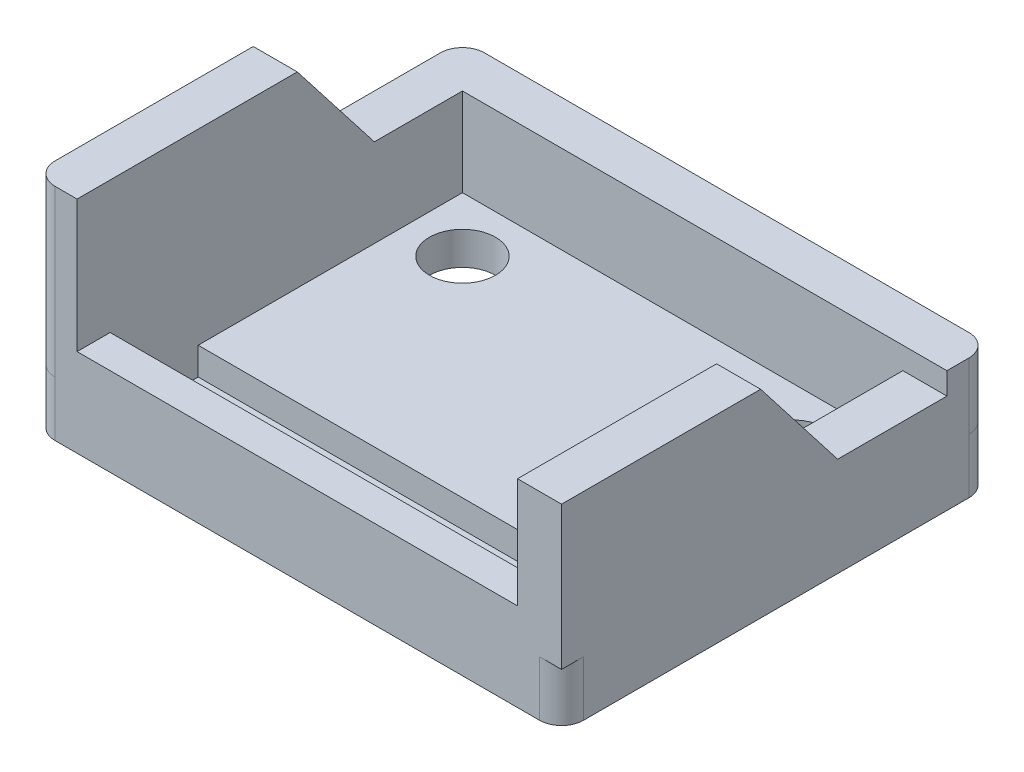
ISO-10303-21;
HEADER;
FILE_DESCRIPTION(('STEP AP214'),'2;1');
FILE_NAME('part.step','',(''),(''),'','','');
FILE_SCHEMA(('AUTOMOTIVE_DESIGN { 1 0 10303 214 1 1 1 1 }'));
ENDSEC;
DATA;
#1=APPLICATION_CONTEXT('core data for automotive mechanical design processes');
#2=APPLICATION_PROTOCOL_DEFINITION('international standard','automotive_design',2000,#1);
#3=PRODUCT_CONTEXT('',#1,'mechanical');
#4=PRODUCT('Part','Part','',(#3));
#5=PRODUCT_RELATED_PRODUCT_CATEGORY('part','',(#4));
#6=PRODUCT_DEFINITION_FORMATION('','',#4);
#7=PRODUCT_DEFINITION_CONTEXT('part definition',#1,'design');
#8=PRODUCT_DEFINITION('design','',#6,#7);
#9=PRODUCT_DEFINITION_SHAPE('','',#8);
#10=(LENGTH_UNIT() NAMED_UNIT(*) SI_UNIT(.MILLI.,.METRE.));
#11=(NAMED_UNIT(*) PLANE_ANGLE_UNIT() SI_UNIT($,.RADIAN.));
#12=(NAMED_UNIT(*) SI_UNIT($,.STERADIAN.) SOLID_ANGLE_UNIT());
#13=UNCERTAINTY_MEASURE_WITH_UNIT(LENGTH_MEASURE(1.E-05),#10,'distance_accuracy_value','');
#14=(GEOMETRIC_REPRESENTATION_CONTEXT(3) GLOBAL_UNCERTAINTY_ASSIGNED_CONTEXT((#13)) GLOBAL_UNIT_ASSIGNED_CONTEXT((#10,
#11,#12)) REPRESENTATION_CONTEXT('',''));
#15=CARTESIAN_POINT('',(0.,0.,0.));
#16=DIRECTION('',(0.,0.,1.));
#17=DIRECTION('',(1.,0.,0.));
#18=AXIS2_PLACEMENT_3D('',#15,#16,#17);
#19=CARTESIAN_POINT('',(0.,2.5,-17.5));
#20=DIRECTION('',(0.,0.,-1.));
#21=DIRECTION('',(-1.,0.,0.));
#22=AXIS2_PLACEMENT_3D('',#19,#20,#21);
#23=PLANE('',#22);
#24=DIRECTION('',(1.,0.,0.));
#25=VECTOR('',#24,1.);
#26=CARTESIAN_POINT('',(3.33184529740553,4.5,-17.5));
#27=LINE('',#26,#25);
#28=CARTESIAN_POINT('',(22.,4.5,-17.5));
#29=VERTEX_POINT('',#28);
#30=CARTESIAN_POINT('',(24.,4.5,-17.5));
#31=VERTEX_POINT('',#30);
#32=EDGE_CURVE('E242',#29,#31,#27,.T.);
#33=ORIENTED_EDGE('',*,*,#32,.T.);
#34=DIRECTION('',(0.,-1.,0.));
#35=VECTOR('',#34,1.);
#36=CARTESIAN_POINT('',(24.,0.,-17.5));
#37=LINE('',#36,#35);
#38=CARTESIAN_POINT('',(24.,5.5,-17.5));
#39=VERTEX_POINT('',#38);
#40=EDGE_CURVE('E231',#39,#31,#37,.T.);
#41=ORIENTED_EDGE('',*,*,#40,.F.);
#42=DIRECTION('',(1.,0.,0.));
#43=VECTOR('',#42,1.);
#44=CARTESIAN_POINT('',(0.,5.5,-17.5));
#45=LINE('',#44,#43);
#46=CARTESIAN_POINT('',(2.,5.5,-17.5));
#47=VERTEX_POINT('',#46);
#48=EDGE_CURVE('E255',#47,#39,#45,.T.);
#49=ORIENTED_EDGE('',*,*,#48,.F.);
#50=DIRECTION('',(0.,-1.,0.));
#51=VECTOR('',#50,1.);
#52=CARTESIAN_POINT('',(2.,2.5,-17.5));
#53=LINE('',#52,#51);
#54=CARTESIAN_POINT('',(2.,1.5,-17.5));
#55=VERTEX_POINT('',#54);
#56=EDGE_CURVE('E370',#47,#55,#53,.T.);
#57=ORIENTED_EDGE('',*,*,#56,.T.);
#58=DIRECTION('',(1.,0.,0.));
#59=VECTOR('',#58,1.);
#60=CARTESIAN_POINT('',(0.,1.5,-17.5));
#61=LINE('',#60,#59);
#62=CARTESIAN_POINT('',(22.,1.5,-17.5));
#63=VERTEX_POINT('',#62);
#64=EDGE_CURVE('E305',#55,#63,#61,.T.);
#65=ORIENTED_EDGE('',*,*,#64,.T.);
#66=DIRECTION('',(0.,-1.,0.));
#67=VECTOR('',#66,1.);
#68=CARTESIAN_POINT('',(22.,2.5,-17.5));
#69=LINE('',#68,#67);
#70=EDGE_CURVE('E367',#29,#63,#69,.T.);
#71=ORIENTED_EDGE('',*,*,#70,.F.);
#72=EDGE_LOOP('',(#33,#41,#49,#57,#65,#71));
#73=FACE_BOUND('',#72,.T.);
#74=ADVANCED_FACE('F39',(#73),#23,.F.);
#75=CARTESIAN_POINT('',(0.,4.,-1.5));
#76=DIRECTION('',(0.,0.,-1.));
#77=DIRECTION('',(-1.,0.,0.));
#78=AXIS2_PLACEMENT_3D('',#75,#76,#77);
#79=PLANE('',#78);
#80=DIRECTION('',(1.,0.,0.));
#81=VECTOR('',#80,1.);
#82=CARTESIAN_POINT('',(0.,0.25,-1.5));
#83=LINE('',#82,#81);
#84=CARTESIAN_POINT('',(2.,0.25,-1.5));
#85=VERTEX_POINT('',#84);
#86=CARTESIAN_POINT('',(22.,0.25,-1.5));
#87=VERTEX_POINT('',#86);
#88=EDGE_CURVE('E291',#85,#87,#83,.T.);
#89=ORIENTED_EDGE('',*,*,#88,.F.);
#90=DIRECTION('',(0.,-1.,0.));
#91=VECTOR('',#90,1.);
#92=CARTESIAN_POINT('',(2.,4.,-1.5));
#93=LINE('',#92,#91);
#94=CARTESIAN_POINT('',(2.,4.,-1.5));
#95=VERTEX_POINT('',#94);
#96=EDGE_CURVE('E392',#95,#85,#93,.T.);
#97=ORIENTED_EDGE('',*,*,#96,.F.);
#98=DIRECTION('',(1.,0.,0.));
#99=VECTOR('',#98,1.);
#100=CARTESIAN_POINT('',(0.,4.,-1.5));
#101=LINE('',#100,#99);
#102=CARTESIAN_POINT('',(22.,4.,-1.5));
#103=VERTEX_POINT('',#102);
#104=EDGE_CURVE('E383',#95,#103,#101,.T.);
#105=ORIENTED_EDGE('',*,*,#104,.T.);
#106=DIRECTION('',(0.,-1.,0.));
#107=VECTOR('',#106,1.);
#108=CARTESIAN_POINT('',(22.,4.,-1.5));
#109=LINE('',#108,#107);
#110=EDGE_CURVE('E395',#103,#87,#109,.T.);
#111=ORIENTED_EDGE('',*,*,#110,.T.);
#112=EDGE_LOOP('',(#89,#97,#105,#111));
#113=FACE_BOUND('',#112,.T.);
#114=ADVANCED_FACE('F454',(#113),#79,.T.);
#115=CARTESIAN_POINT('',(0.,4.,0.));
#116=DIRECTION('',(0.,0.,-1.));
#117=DIRECTION('',(-1.,0.,0.));
#118=AXIS2_PLACEMENT_3D('',#115,#116,#117);
#119=PLANE('',#118);
#120=DIRECTION('',(-1.,0.,0.));
#121=VECTOR('',#120,1.);
#122=CARTESIAN_POINT('',(21.0394327646598,10.,0.));
#123=LINE('',#122,#121);
#124=CARTESIAN_POINT('',(2.,10.,0.));
#125=VERTEX_POINT('',#124);
#126=CARTESIAN_POINT('',(1.,10.,0.));
#127=VERTEX_POINT('',#126);
#128=EDGE_CURVE('E264',#125,#127,#123,.T.);
#129=ORIENTED_EDGE('',*,*,#128,.T.);
#130=DIRECTION('',(0.,-1.,0.));
#131=VECTOR('',#130,1.);
#132=CARTESIAN_POINT('',(1.,2.5,0.));
#133=LINE('',#132,#131);
#134=CARTESIAN_POINT('',(1.,2.5,0.));
#135=VERTEX_POINT('',#134);
#136=EDGE_CURVE('E411',#127,#135,#133,.T.);
#137=ORIENTED_EDGE('',*,*,#136,.T.);
#138=DIRECTION('',(0.,-1.,0.));
#139=VECTOR('',#138,1.);
#140=CARTESIAN_POINT('',(1.00000000000001,2.5,0.));
#141=LINE('',#140,#139);
#142=CARTESIAN_POINT('',(1.00000000000001,0.,0.));
#143=VERTEX_POINT('',#142);
#144=EDGE_CURVE('E373',#135,#143,#141,.T.);
#145=ORIENTED_EDGE('',*,*,#144,.T.);
#146=DIRECTION('',(1.,0.,0.));
#147=VECTOR('',#146,1.);
#148=CARTESIAN_POINT('',(0.,0.,0.));
#149=LINE('',#148,#147);
#150=CARTESIAN_POINT('',(23.,0.,0.));
#151=VERTEX_POINT('',#150);
#152=EDGE_CURVE('E380',#143,#151,#149,.T.);
#153=ORIENTED_EDGE('',*,*,#152,.T.);
#154=DIRECTION('',(0.,-1.,0.));
#155=VECTOR('',#154,1.);
#156=CARTESIAN_POINT('',(23.,2.5,0.));
#157=LINE('',#156,#155);
#158=CARTESIAN_POINT('',(23.,2.5,0.));
#159=VERTEX_POINT('',#158);
#160=EDGE_CURVE('E364',#159,#151,#157,.T.);
#161=ORIENTED_EDGE('',*,*,#160,.F.);
#162=DIRECTION('',(1.,0.,0.));
#163=VECTOR('',#162,1.);
#164=CARTESIAN_POINT('',(3.33184529740553,2.5,0.));
#165=LINE('',#164,#163);
#166=CARTESIAN_POINT('',(24.,2.5,0.));
#167=VERTEX_POINT('',#166);
#168=EDGE_CURVE('E245',#159,#167,#165,.T.);
#169=ORIENTED_EDGE('',*,*,#168,.T.);
#170=DIRECTION('',(0.,-1.,0.));
#171=VECTOR('',#170,1.);
#172=CARTESIAN_POINT('',(24.,0.,0.));
#173=LINE('',#172,#171);
#174=CARTESIAN_POINT('',(24.,9.,0.));
#175=VERTEX_POINT('',#174);
#176=EDGE_CURVE('E237',#175,#167,#173,.T.);
#177=ORIENTED_EDGE('',*,*,#176,.F.);
#178=DIRECTION('',(1.,0.,0.));
#179=VECTOR('',#178,1.);
#180=CARTESIAN_POINT('',(3.33184529740553,9.,0.));
#181=LINE('',#180,#179);
#182=CARTESIAN_POINT('',(22.,9.,0.));
#183=VERTEX_POINT('',#182);
#184=EDGE_CURVE('E247',#183,#175,#181,.T.);
#185=ORIENTED_EDGE('',*,*,#184,.F.);
#186=DIRECTION('',(0.,1.,0.));
#187=VECTOR('',#186,1.);
#188=CARTESIAN_POINT('',(22.,0.,0.));
#189=LINE('',#188,#187);
#190=CARTESIAN_POINT('',(22.,4.,0.));
#191=VERTEX_POINT('',#190);
#192=EDGE_CURVE('E440',#191,#183,#189,.T.);
#193=ORIENTED_EDGE('',*,*,#192,.F.);
#194=DIRECTION('',(1.,0.,0.));
#195=VECTOR('',#194,1.);
#196=CARTESIAN_POINT('',(0.,4.,0.));
#197=LINE('',#196,#195);
#198=CARTESIAN_POINT('',(2.,4.,0.));
#199=VERTEX_POINT('',#198);
#200=EDGE_CURVE('E389',#199,#191,#197,.T.);
#201=ORIENTED_EDGE('',*,*,#200,.F.);
#202=DIRECTION('',(0.,-1.,0.));
#203=VECTOR('',#202,1.);
#204=CARTESIAN_POINT('',(2.,0.,0.));
#205=LINE('',#204,#203);
#206=EDGE_CURVE('E271',#125,#199,#205,.T.);
#207=ORIENTED_EDGE('',*,*,#206,.F.);
#208=EDGE_LOOP('',(#129,#137,#145,#153,#161,#169,#177,#185,#193,#201,#207));
#209=FACE_BOUND('',#208,.T.);
#210=ADVANCED_FACE('F416',(#209),#119,.F.);
#211=CARTESIAN_POINT('',(0.,4.,0.));
#212=DIRECTION('',(0.,1.,0.));
#213=DIRECTION('',(0.,0.,1.));
#214=AXIS2_PLACEMENT_3D('',#211,#212,#213);
#215=PLANE('',#214);
#216=DIRECTION('',(0.,0.,1.));
#217=VECTOR('',#216,1.);
#218=CARTESIAN_POINT('',(22.,4.,0.));
#219=LINE('',#218,#217);
#220=EDGE_CURVE('E381',#103,#191,#219,.T.);
#221=ORIENTED_EDGE('',*,*,#220,.F.);
#222=ORIENTED_EDGE('',*,*,#104,.F.);
#223=DIRECTION('',(0.,0.,1.));
#224=VECTOR('',#223,1.);
#225=CARTESIAN_POINT('',(2.,4.,0.));
#226=LINE('',#225,#224);
#227=EDGE_CURVE('E386',#95,#199,#226,.T.);
#228=ORIENTED_EDGE('',*,*,#227,.T.);
#229=ORIENTED_EDGE('',*,*,#200,.T.);
#230=EDGE_LOOP('',(#221,#222,#228,#229));
#231=FACE_BOUND('',#230,.T.);
#232=ADVANCED_FACE('F450',(#231),#215,.T.);
#233=CARTESIAN_POINT('',(0.,0.,0.));
#234=DIRECTION('',(0.,1.,0.));
#235=DIRECTION('',(0.,0.,1.));
#236=AXIS2_PLACEMENT_3D('',#233,#234,#235);
#237=PLANE('',#236);
#238=ORIENTED_EDGE('',*,*,#152,.F.);
#239=CARTESIAN_POINT('',(1.,0.,-1.));
#240=DIRECTION('',(0.,1.,0.));
#241=DIRECTION('',(0.,0.,1.));
#242=AXIS2_PLACEMENT_3D('',#239,#240,#241);
#243=CIRCLE('',#242,1.);
#244=CARTESIAN_POINT('',(0.,0.,-1.00000000000001));
#245=VERTEX_POINT('',#244);
#246=EDGE_CURVE('E343',#143,#245,#243,.F.);
#247=ORIENTED_EDGE('',*,*,#246,.T.);
#248=DIRECTION('',(0.,0.,-1.));
#249=VECTOR('',#248,1.);
#250=CARTESIAN_POINT('',(0.,0.,0.));
#251=LINE('',#250,#249);
#252=CARTESIAN_POINT('',(0.,0.,-18.5));
#253=VERTEX_POINT('',#252);
#254=EDGE_CURVE('E340',#245,#253,#251,.T.);
#255=ORIENTED_EDGE('',*,*,#254,.T.);
#256=CARTESIAN_POINT('',(1.,0.,-18.5));
#257=DIRECTION('',(0.,1.,0.));
#258=DIRECTION('',(0.,0.,1.));
#259=AXIS2_PLACEMENT_3D('',#256,#257,#258);
#260=CIRCLE('',#259,1.);
#261=CARTESIAN_POINT('',(1.00000000000001,0.,-19.5));
#262=VERTEX_POINT('',#261);
#263=EDGE_CURVE('E324',#253,#262,#260,.F.);
#264=ORIENTED_EDGE('',*,*,#263,.T.);
#265=DIRECTION('',(1.,0.,0.));
#266=VECTOR('',#265,1.);
#267=CARTESIAN_POINT('',(0.,0.,-19.5));
#268=LINE('',#267,#266);
#269=CARTESIAN_POINT('',(23.,0.,-19.5));
#270=VERTEX_POINT('',#269);
#271=EDGE_CURVE('E329',#262,#270,#268,.T.);
#272=ORIENTED_EDGE('',*,*,#271,.T.);
#273=CARTESIAN_POINT('',(23.,0.,-18.5));
#274=DIRECTION('',(0.,1.,0.));
#275=DIRECTION('',(0.,0.,1.));
#276=AXIS2_PLACEMENT_3D('',#273,#274,#275);
#277=CIRCLE('',#276,1.);
#278=CARTESIAN_POINT('',(24.,0.,-18.5));
#279=VERTEX_POINT('',#278);
#280=EDGE_CURVE('E351',#270,#279,#277,.F.);
#281=ORIENTED_EDGE('',*,*,#280,.T.);
#282=DIRECTION('',(0.,0.,-1.));
#283=VECTOR('',#282,1.);
#284=CARTESIAN_POINT('',(24.,0.,0.));
#285=LINE('',#284,#283);
#286=CARTESIAN_POINT('',(24.,0.,-1.00000000000001));
#287=VERTEX_POINT('',#286);
#288=EDGE_CURVE('E348',#287,#279,#285,.T.);
#289=ORIENTED_EDGE('',*,*,#288,.F.);
#290=CARTESIAN_POINT('',(23.,0.,-1.));
#291=DIRECTION('',(0.,1.,0.));
#292=DIRECTION('',(0.,0.,1.));
#293=AXIS2_PLACEMENT_3D('',#290,#291,#292);
#294=CIRCLE('',#293,1.);
#295=EDGE_CURVE('E346',#151,#287,#294,.T.);
#296=ORIENTED_EDGE('',*,*,#295,.F.);
#297=EDGE_LOOP('',(#238,#247,#255,#264,#272,#281,#289,#296));
#298=FACE_BOUND('',#297,.T.);
#299=CARTESIAN_POINT('',(4.5,0.,-15.));
#300=DIRECTION('',(0.,1.,0.));
#301=DIRECTION('',(0.,0.,1.));
#302=AXIS2_PLACEMENT_3D('',#299,#300,#301);
#303=CIRCLE('',#302,1.5);
#304=CARTESIAN_POINT('',(4.5,0.,-13.5));
#305=VERTEX_POINT('',#304);
#306=EDGE_CURVE('E297',#305,#305,#303,.T.);
#307=ORIENTED_EDGE('',*,*,#306,.T.);
#308=EDGE_LOOP('',(#307));
#309=FACE_BOUND('',#308,.T.);
#310=CARTESIAN_POINT('',(19.5,0.,-15.));
#311=DIRECTION('',(0.,1.,0.));
#312=DIRECTION('',(0.,0.,1.));
#313=AXIS2_PLACEMENT_3D('',#310,#311,#312);
#314=CIRCLE('',#313,1.5);
#315=CARTESIAN_POINT('',(19.5,0.,-13.5));
#316=VERTEX_POINT('',#315);
#317=EDGE_CURVE('E302',#316,#316,#314,.F.);
#318=ORIENTED_EDGE('',*,*,#317,.F.);
#319=EDGE_LOOP('',(#318));
#320=FACE_BOUND('',#319,.T.);
#321=ADVANCED_FACE('F423',(#298,#309,#320),#237,.F.);
#322=CARTESIAN_POINT('',(1.,2.5,-18.5));
#323=DIRECTION('',(0.,-1.,0.));
#324=DIRECTION('',(0.,0.,-1.));
#325=AXIS2_PLACEMENT_3D('',#322,#323,#324);
#326=CYLINDRICAL_SURFACE('',#325,1.);
#327=ORIENTED_EDGE('',*,*,#263,.F.);
#328=DIRECTION('',(0.,-1.,0.));
#329=VECTOR('',#328,1.);
#330=CARTESIAN_POINT('',(0.,2.5,-18.5));
#331=LINE('',#330,#329);
#332=CARTESIAN_POINT('',(0.,2.5,-18.5));
#333=VERTEX_POINT('',#332);
#334=EDGE_CURVE('E378',#333,#253,#331,.T.);
#335=ORIENTED_EDGE('',*,*,#334,.F.);
#336=CARTESIAN_POINT('',(1.,2.5,-18.5));
#337=DIRECTION('',(0.,1.,0.));
#338=DIRECTION('',(0.,0.,1.));
#339=AXIS2_PLACEMENT_3D('',#336,#337,#338);
#340=CIRCLE('',#339,1.);
#341=CARTESIAN_POINT('',(1.00000000000001,2.5,-19.5));
#342=VERTEX_POINT('',#341);
#343=EDGE_CURVE('E325',#333,#342,#340,.F.);
#344=ORIENTED_EDGE('',*,*,#343,.T.);
#345=DIRECTION('',(0.,-1.,0.));
#346=VECTOR('',#345,1.);
#347=CARTESIAN_POINT('',(1.00000000000001,2.5,-19.5));
#348=LINE('',#347,#346);
#349=EDGE_CURVE('E337',#342,#262,#348,.T.);
#350=ORIENTED_EDGE('',*,*,#349,.T.);
#351=EDGE_LOOP('',(#327,#335,#344,#350));
#352=FACE_BOUND('',#351,.T.);
#353=ADVANCED_FACE('F480',(#352),#326,.T.);
#354=CARTESIAN_POINT('',(0.,2.5,0.));
#355=DIRECTION('',(-1.,0.,0.));
#356=DIRECTION('',(0.,0.,1.));
#357=AXIS2_PLACEMENT_3D('',#354,#355,#356);
#358=PLANE('',#357);
#359=DIRECTION('',(0.,-1.,0.));
#360=VECTOR('',#359,1.);
#361=CARTESIAN_POINT('',(0.,2.5,-1.00000000000001));
#362=LINE('',#361,#360);
#363=CARTESIAN_POINT('',(0.,2.5,-1.00000000000001));
#364=VERTEX_POINT('',#363);
#365=EDGE_CURVE('E376',#364,#245,#362,.T.);
#366=ORIENTED_EDGE('',*,*,#365,.F.);
#367=DIRECTION('',(0.,-1.,0.));
#368=VECTOR('',#367,1.);
#369=CARTESIAN_POINT('',(0.,10.,-1.));
#370=LINE('',#369,#368);
#371=CARTESIAN_POINT('',(0.,10.,-1.));
#372=VERTEX_POINT('',#371);
#373=EDGE_CURVE('E47',#364,#372,#370,.F.);
#374=ORIENTED_EDGE('',*,*,#373,.T.);
#375=DIRECTION('',(0.,0.,1.));
#376=VECTOR('',#375,1.);
#377=CARTESIAN_POINT('',(0.,10.,0.));
#378=LINE('',#377,#376);
#379=CARTESIAN_POINT('',(0.,10.,-10.));
#380=VERTEX_POINT('',#379);
#381=EDGE_CURVE('E262',#380,#372,#378,.T.);
#382=ORIENTED_EDGE('',*,*,#381,.F.);
#383=DIRECTION('',(0.,0.789352217376327,0.61394061351492));
#384=VECTOR('',#383,1.);
#385=CARTESIAN_POINT('',(0.,8.61538461538461,-11.0769230769231));
#386=LINE('',#385,#384);
#387=CARTESIAN_POINT('',(0.,5.5,-13.5));
#388=VERTEX_POINT('',#387);
#389=EDGE_CURVE('E266',#388,#380,#386,.T.);
#390=ORIENTED_EDGE('',*,*,#389,.F.);
#391=DIRECTION('',(0.,0.,1.));
#392=VECTOR('',#391,1.);
#393=CARTESIAN_POINT('',(0.,5.49999999999999,0.));
#394=LINE('',#393,#392);
#395=CARTESIAN_POINT('',(0.,5.5,-18.5));
#396=VERTEX_POINT('',#395);
#397=EDGE_CURVE('E259',#396,#388,#394,.T.);
#398=ORIENTED_EDGE('',*,*,#397,.F.);
#399=DIRECTION('',(0.,1.,0.));
#400=VECTOR('',#399,1.);
#401=CARTESIAN_POINT('',(0.,2.5,-18.5));
#402=LINE('',#401,#400);
#403=EDGE_CURVE('E409',#396,#333,#402,.F.);
#404=ORIENTED_EDGE('',*,*,#403,.T.);
#405=ORIENTED_EDGE('',*,*,#334,.T.);
#406=ORIENTED_EDGE('',*,*,#254,.F.);
#407=EDGE_LOOP('',(#366,#374,#382,#390,#398,#404,#405,#406));
#408=FACE_BOUND('',#407,.T.);
#409=ADVANCED_FACE('F472',(#408),#358,.T.);
#410=CARTESIAN_POINT('',(1.,2.5,-1.));
#411=DIRECTION('',(0.,-1.,0.));
#412=DIRECTION('',(0.,0.,-1.));
#413=AXIS2_PLACEMENT_3D('',#410,#411,#412);
#414=CYLINDRICAL_SURFACE('',#413,1.);
#415=ORIENTED_EDGE('',*,*,#246,.F.);
#416=ORIENTED_EDGE('',*,*,#144,.F.);
#417=CARTESIAN_POINT('',(1.,2.5,-1.));
#418=DIRECTION('',(0.,1.,0.));
#419=DIRECTION('',(0.,0.,1.));
#420=AXIS2_PLACEMENT_3D('',#417,#418,#419);
#421=CIRCLE('',#420,1.);
#422=EDGE_CURVE('E328',#135,#364,#421,.F.);
#423=ORIENTED_EDGE('',*,*,#422,.T.);
#424=ORIENTED_EDGE('',*,*,#365,.T.);
#425=EDGE_LOOP('',(#415,#416,#423,#424));
#426=FACE_BOUND('',#425,.T.);
#427=ADVANCED_FACE('F420',(#426),#414,.T.);
#428=CARTESIAN_POINT('',(2.,2.5,0.));
#429=DIRECTION('',(1.,0.,0.));
#430=DIRECTION('',(0.,0.,-1.));
#431=AXIS2_PLACEMENT_3D('',#428,#429,#430);
#432=PLANE('',#431);
#433=DIRECTION('',(0.,0.,-1.));
#434=VECTOR('',#433,1.);
#435=CARTESIAN_POINT('',(2.,1.5,0.));
#436=LINE('',#435,#434);
#437=CARTESIAN_POINT('',(2.,1.5,-5.5));
#438=VERTEX_POINT('',#437);
#439=EDGE_CURVE('E307',#438,#55,#436,.T.);
#440=ORIENTED_EDGE('',*,*,#439,.T.);
#441=ORIENTED_EDGE('',*,*,#56,.F.);
#442=DIRECTION('',(0.,0.,1.));
#443=VECTOR('',#442,1.);
#444=CARTESIAN_POINT('',(2.,5.49999999999999,0.));
#445=LINE('',#444,#443);
#446=CARTESIAN_POINT('',(2.,5.5,-13.5));
#447=VERTEX_POINT('',#446);
#448=EDGE_CURVE('E280',#47,#447,#445,.T.);
#449=ORIENTED_EDGE('',*,*,#448,.T.);
#450=DIRECTION('',(0.,0.789352217376327,0.61394061351492));
#451=VECTOR('',#450,1.);
#452=CARTESIAN_POINT('',(2.,8.61538461538461,-11.0769230769231));
#453=LINE('',#452,#451);
#454=CARTESIAN_POINT('',(2.,10.,-10.));
#455=VERTEX_POINT('',#454);
#456=EDGE_CURVE('E277',#447,#455,#453,.T.);
#457=ORIENTED_EDGE('',*,*,#456,.T.);
#458=DIRECTION('',(0.,0.,1.));
#459=VECTOR('',#458,1.);
#460=CARTESIAN_POINT('',(2.,10.,0.));
#461=LINE('',#460,#459);
#462=EDGE_CURVE('E274',#455,#125,#461,.T.);
#463=ORIENTED_EDGE('',*,*,#462,.T.);
#464=ORIENTED_EDGE('',*,*,#206,.T.);
#465=ORIENTED_EDGE('',*,*,#227,.F.);
#466=ORIENTED_EDGE('',*,*,#96,.T.);
#467=DIRECTION('',(0.,0.,-1.));
#468=VECTOR('',#467,1.);
#469=CARTESIAN_POINT('',(2.,0.25,0.));
#470=LINE('',#469,#468);
#471=CARTESIAN_POINT('',(2.,0.25,-5.5));
#472=VERTEX_POINT('',#471);
#473=EDGE_CURVE('E289',#85,#472,#470,.T.);
#474=ORIENTED_EDGE('',*,*,#473,.T.);
#475=DIRECTION('',(0.,-1.,0.));
#476=VECTOR('',#475,1.);
#477=CARTESIAN_POINT('',(2.,1.5,-5.5));
#478=LINE('',#477,#476);
#479=EDGE_CURVE('E315',#438,#472,#478,.T.);
#480=ORIENTED_EDGE('',*,*,#479,.F.);
#481=EDGE_LOOP('',(#440,#441,#449,#457,#463,#464,#465,#466,#474,#480));
#482=FACE_BOUND('',#481,.T.);
#483=ADVANCED_FACE('F457',(#482),#432,.T.);
#484=CARTESIAN_POINT('',(22.,2.5,0.));
#485=DIRECTION('',(-1.,0.,0.));
#486=DIRECTION('',(0.,0.,1.));
#487=AXIS2_PLACEMENT_3D('',#484,#485,#486);
#488=PLANE('',#487);
#489=DIRECTION('',(0.,0.,-1.));
#490=VECTOR('',#489,1.);
#491=CARTESIAN_POINT('',(22.,1.5,0.));
#492=LINE('',#491,#490);
#493=CARTESIAN_POINT('',(22.,1.5,-5.5));
#494=VERTEX_POINT('',#493);
#495=EDGE_CURVE('E301',#494,#63,#492,.T.);
#496=ORIENTED_EDGE('',*,*,#495,.F.);
#497=DIRECTION('',(0.,-1.,0.));
#498=VECTOR('',#497,1.);
#499=CARTESIAN_POINT('',(22.,1.5,-5.5));
#500=LINE('',#499,#498);
#501=CARTESIAN_POINT('',(22.,0.25,-5.5));
#502=VERTEX_POINT('',#501);
#503=EDGE_CURVE('E322',#494,#502,#500,.T.);
#504=ORIENTED_EDGE('',*,*,#503,.T.);
#505=DIRECTION('',(0.,0.,-1.));
#506=VECTOR('',#505,1.);
#507=CARTESIAN_POINT('',(22.,0.25,0.));
#508=LINE('',#507,#506);
#509=EDGE_CURVE('E294',#87,#502,#508,.T.);
#510=ORIENTED_EDGE('',*,*,#509,.F.);
#511=ORIENTED_EDGE('',*,*,#110,.F.);
#512=ORIENTED_EDGE('',*,*,#220,.T.);
#513=ORIENTED_EDGE('',*,*,#192,.T.);
#514=DIRECTION('',(0.,0.,1.));
#515=VECTOR('',#514,1.);
#516=CARTESIAN_POINT('',(22.,9.,0.));
#517=LINE('',#516,#515);
#518=CARTESIAN_POINT('',(22.,9.,-9.0406678658267));
#519=VERTEX_POINT('',#518);
#520=EDGE_CURVE('E251',#519,#183,#517,.T.);
#521=ORIENTED_EDGE('',*,*,#520,.F.);
#522=DIRECTION('',(0.,0.789405615632697,0.613871952452271));
#523=VECTOR('',#522,1.);
#524=CARTESIAN_POINT('',(22.,7.77260206738703,-9.99513936996607));
#525=LINE('',#524,#523);
#526=CARTESIAN_POINT('',(22.,4.5,-12.5400397113401));
#527=VERTEX_POINT('',#526);
#528=EDGE_CURVE('E244',#527,#519,#525,.T.);
#529=ORIENTED_EDGE('',*,*,#528,.F.);
#530=DIRECTION('',(0.,0.,1.));
#531=VECTOR('',#530,1.);
#532=CARTESIAN_POINT('',(22.,4.5,0.));
#533=LINE('',#532,#531);
#534=EDGE_CURVE('E213',#29,#527,#533,.T.);
#535=ORIENTED_EDGE('',*,*,#534,.F.);
#536=ORIENTED_EDGE('',*,*,#70,.T.);
#537=EDGE_LOOP('',(#496,#504,#510,#511,#512,#513,#521,#529,#535,#536));
#538=FACE_BOUND('',#537,.T.);
#539=ADVANCED_FACE('F445',(#538),#488,.T.);
#540=CARTESIAN_POINT('',(23.,2.5,-1.));
#541=DIRECTION('',(0.,-1.,0.));
#542=DIRECTION('',(0.,0.,-1.));
#543=AXIS2_PLACEMENT_3D('',#540,#541,#542);
#544=CYLINDRICAL_SURFACE('',#543,1.);
#545=ORIENTED_EDGE('',*,*,#295,.T.);
#546=DIRECTION('',(0.,-1.,0.));
#547=VECTOR('',#546,1.);
#548=CARTESIAN_POINT('',(24.,2.5,-1.00000000000001));
#549=LINE('',#548,#547);
#550=CARTESIAN_POINT('',(24.,2.5,-1.));
#551=VERTEX_POINT('',#550);
#552=EDGE_CURVE('E361',#551,#287,#549,.T.);
#553=ORIENTED_EDGE('',*,*,#552,.F.);
#554=CARTESIAN_POINT('',(23.,2.5,-1.));
#555=DIRECTION('',(0.,1.,0.));
#556=DIRECTION('',(0.,0.,1.));
#557=AXIS2_PLACEMENT_3D('',#554,#555,#556);
#558=CIRCLE('',#557,1.);
#559=EDGE_CURVE('E332',#159,#551,#558,.T.);
#560=ORIENTED_EDGE('',*,*,#559,.F.);
#561=ORIENTED_EDGE('',*,*,#160,.T.);
#562=EDGE_LOOP('',(#545,#553,#560,#561));
#563=FACE_BOUND('',#562,.T.);
#564=ADVANCED_FACE('F430',(#563),#544,.T.);
#565=CARTESIAN_POINT('',(24.,2.5,0.));
#566=DIRECTION('',(-1.,0.,0.));
#567=DIRECTION('',(0.,0.,1.));
#568=AXIS2_PLACEMENT_3D('',#565,#566,#567);
#569=PLANE('',#568);
#570=DIRECTION('',(0.,-1.,0.));
#571=VECTOR('',#570,1.);
#572=CARTESIAN_POINT('',(24.,2.5,-18.5));
#573=LINE('',#572,#571);
#574=CARTESIAN_POINT('',(24.,2.5,-18.5));
#575=VERTEX_POINT('',#574);
#576=EDGE_CURVE('E359',#575,#279,#573,.T.);
#577=ORIENTED_EDGE('',*,*,#576,.F.);
#578=DIRECTION('',(0.,1.,0.));
#579=VECTOR('',#578,1.);
#580=CARTESIAN_POINT('',(24.,5.5,-18.5));
#581=LINE('',#580,#579);
#582=CARTESIAN_POINT('',(24.,5.5,-18.5));
#583=VERTEX_POINT('',#582);
#584=EDGE_CURVE('E397',#575,#583,#581,.T.);
#585=ORIENTED_EDGE('',*,*,#584,.T.);
#586=DIRECTION('',(0.,0.,1.));
#587=VECTOR('',#586,1.);
#588=CARTESIAN_POINT('',(24.,5.49999999999999,0.));
#589=LINE('',#588,#587);
#590=EDGE_CURVE('E252',#583,#39,#589,.T.);
#591=ORIENTED_EDGE('',*,*,#590,.T.);
#592=ORIENTED_EDGE('',*,*,#40,.T.);
#593=DIRECTION('',(0.,0.,-1.));
#594=VECTOR('',#593,1.);
#595=CARTESIAN_POINT('',(24.,4.5,0.));
#596=LINE('',#595,#594);
#597=CARTESIAN_POINT('',(24.,4.5,-12.5400397113401));
#598=VERTEX_POINT('',#597);
#599=EDGE_CURVE('E210',#598,#31,#596,.T.);
#600=ORIENTED_EDGE('',*,*,#599,.F.);
#601=DIRECTION('',(0.,-0.789405615632697,-0.613871952452271));
#602=VECTOR('',#601,1.);
#603=CARTESIAN_POINT('',(24.,7.77260206738703,-9.99513936996607));
#604=LINE('',#603,#602);
#605=CARTESIAN_POINT('',(24.,9.,-9.0406678658267));
#606=VERTEX_POINT('',#605);
#607=EDGE_CURVE('E220',#606,#598,#604,.T.);
#608=ORIENTED_EDGE('',*,*,#607,.F.);
#609=DIRECTION('',(0.,0.,-1.));
#610=VECTOR('',#609,1.);
#611=CARTESIAN_POINT('',(24.,9.,0.));
#612=LINE('',#611,#610);
#613=EDGE_CURVE('E226',#175,#606,#612,.T.);
#614=ORIENTED_EDGE('',*,*,#613,.F.);
#615=ORIENTED_EDGE('',*,*,#176,.T.);
#616=DIRECTION('',(0.,0.,-1.));
#617=VECTOR('',#616,1.);
#618=CARTESIAN_POINT('',(24.,2.5,0.));
#619=LINE('',#618,#617);
#620=EDGE_CURVE('E217',#167,#551,#619,.T.);
#621=ORIENTED_EDGE('',*,*,#620,.T.);
#622=ORIENTED_EDGE('',*,*,#552,.T.);
#623=ORIENTED_EDGE('',*,*,#288,.T.);
#624=EDGE_LOOP('',(#577,#585,#591,#592,#600,#608,#614,#615,#621,#622,#623));
#625=FACE_BOUND('',#624,.T.);
#626=ADVANCED_FACE('F229',(#625),#569,.F.);
#627=CARTESIAN_POINT('',(23.,2.5,-18.5));
#628=DIRECTION('',(0.,-1.,0.));
#629=DIRECTION('',(0.,0.,-1.));
#630=AXIS2_PLACEMENT_3D('',#627,#628,#629);
#631=CYLINDRICAL_SURFACE('',#630,1.);
#632=ORIENTED_EDGE('',*,*,#280,.F.);
#633=DIRECTION('',(0.,-1.,0.));
#634=VECTOR('',#633,1.);
#635=CARTESIAN_POINT('',(23.,2.5,-19.5));
#636=LINE('',#635,#634);
#637=CARTESIAN_POINT('',(23.,2.5,-19.5));
#638=VERTEX_POINT('',#637);
#639=EDGE_CURVE('E357',#638,#270,#636,.T.);
#640=ORIENTED_EDGE('',*,*,#639,.F.);
#641=CARTESIAN_POINT('',(23.,2.5,-18.5));
#642=DIRECTION('',(0.,1.,0.));
#643=DIRECTION('',(0.,0.,1.));
#644=AXIS2_PLACEMENT_3D('',#641,#642,#643);
#645=CIRCLE('',#644,1.);
#646=EDGE_CURVE('E334',#638,#575,#645,.F.);
#647=ORIENTED_EDGE('',*,*,#646,.T.);
#648=ORIENTED_EDGE('',*,*,#576,.T.);
#649=EDGE_LOOP('',(#632,#640,#647,#648));
#650=FACE_BOUND('',#649,.T.);
#651=ADVANCED_FACE('F489',(#650),#631,.T.);
#652=CARTESIAN_POINT('',(0.,2.5,-19.5));
#653=DIRECTION('',(0.,0.,-1.));
#654=DIRECTION('',(-1.,0.,0.));
#655=AXIS2_PLACEMENT_3D('',#652,#653,#654);
#656=PLANE('',#655);
#657=DIRECTION('',(1.,0.,0.));
#658=VECTOR('',#657,1.);
#659=CARTESIAN_POINT('',(0.,5.5,-19.5));
#660=LINE('',#659,#658);
#661=CARTESIAN_POINT('',(1.,5.5,-19.5));
#662=VERTEX_POINT('',#661);
#663=CARTESIAN_POINT('',(23.,5.5,-19.5));
#664=VERTEX_POINT('',#663);
#665=EDGE_CURVE('E256',#662,#664,#660,.T.);
#666=ORIENTED_EDGE('',*,*,#665,.T.);
#667=DIRECTION('',(0.,1.,0.));
#668=VECTOR('',#667,1.);
#669=CARTESIAN_POINT('',(23.,2.5,-19.5));
#670=LINE('',#669,#668);
#671=EDGE_CURVE('E407',#664,#638,#670,.F.);
#672=ORIENTED_EDGE('',*,*,#671,.T.);
#673=ORIENTED_EDGE('',*,*,#639,.T.);
#674=ORIENTED_EDGE('',*,*,#271,.F.);
#675=ORIENTED_EDGE('',*,*,#349,.F.);
#676=DIRECTION('',(0.,1.,0.));
#677=VECTOR('',#676,1.);
#678=CARTESIAN_POINT('',(1.,2.5,-19.5));
#679=LINE('',#678,#677);
#680=EDGE_CURVE('E404',#342,#662,#679,.T.);
#681=ORIENTED_EDGE('',*,*,#680,.T.);
#682=EDGE_LOOP('',(#666,#672,#673,#674,#675,#681));
#683=FACE_BOUND('',#682,.T.);
#684=ADVANCED_FACE('F483',(#683),#656,.T.);
#685=CARTESIAN_POINT('',(0.,1.5,-5.5));
#686=DIRECTION('',(0.,0.,-1.));
#687=DIRECTION('',(-1.,0.,0.));
#688=AXIS2_PLACEMENT_3D('',#685,#686,#687);
#689=PLANE('',#688);
#690=ORIENTED_EDGE('',*,*,#479,.T.);
#691=DIRECTION('',(1.,0.,0.));
#692=VECTOR('',#691,1.);
#693=CARTESIAN_POINT('',(0.,0.25,-5.5));
#694=LINE('',#693,#692);
#695=EDGE_CURVE('E273',#472,#502,#694,.T.);
#696=ORIENTED_EDGE('',*,*,#695,.T.);
#697=ORIENTED_EDGE('',*,*,#503,.F.);
#698=DIRECTION('',(1.,0.,0.));
#699=VECTOR('',#698,1.);
#700=CARTESIAN_POINT('',(0.,1.5,-5.5));
#701=LINE('',#700,#699);
#702=EDGE_CURVE('E298',#438,#494,#701,.T.);
#703=ORIENTED_EDGE('',*,*,#702,.F.);
#704=EDGE_LOOP('',(#690,#696,#697,#703));
#705=FACE_BOUND('',#704,.T.);
#706=ADVANCED_FACE('F503',(#705),#689,.F.);
#707=CARTESIAN_POINT('',(4.5,1.5,-15.));
#708=DIRECTION('',(0.,-1.,0.));
#709=DIRECTION('',(0.,0.,-1.));
#710=AXIS2_PLACEMENT_3D('',#707,#708,#709);
#711=CYLINDRICAL_SURFACE('',#710,1.5);
#712=CARTESIAN_POINT('',(4.5,1.5,-15.));
#713=DIRECTION('',(0.,1.,0.));
#714=DIRECTION('',(0.,0.,1.));
#715=AXIS2_PLACEMENT_3D('',#712,#713,#714);
#716=CIRCLE('',#715,1.5);
#717=CARTESIAN_POINT('',(4.5,1.5,-13.5));
#718=VERTEX_POINT('',#717);
#719=EDGE_CURVE('E309',#718,#718,#716,.T.);
#720=ORIENTED_EDGE('',*,*,#719,.T.);
#721=EDGE_LOOP('',(#720));
#722=FACE_BOUND('',#721,.T.);
#723=ORIENTED_EDGE('',*,*,#306,.F.);
#724=EDGE_LOOP('',(#723));
#725=FACE_BOUND('',#724,.T.);
#726=ADVANCED_FACE('F633',(#722,#725),#711,.F.);
#727=CARTESIAN_POINT('',(19.5,1.5,-15.));
#728=DIRECTION('',(0.,-1.,0.));
#729=DIRECTION('',(0.,0.,-1.));
#730=AXIS2_PLACEMENT_3D('',#727,#728,#729);
#731=CYLINDRICAL_SURFACE('',#730,1.5);
#732=CARTESIAN_POINT('',(19.5,1.5,-15.));
#733=DIRECTION('',(0.,1.,0.));
#734=DIRECTION('',(0.,0.,1.));
#735=AXIS2_PLACEMENT_3D('',#732,#733,#734);
#736=CIRCLE('',#735,1.5);
#737=CARTESIAN_POINT('',(19.5,1.5,-13.5));
#738=VERTEX_POINT('',#737);
#739=EDGE_CURVE('E312',#738,#738,#736,.F.);
#740=ORIENTED_EDGE('',*,*,#739,.F.);
#741=EDGE_LOOP('',(#740));
#742=FACE_BOUND('',#741,.T.);
#743=ORIENTED_EDGE('',*,*,#317,.T.);
#744=EDGE_LOOP('',(#743));
#745=FACE_BOUND('',#744,.T.);
#746=ADVANCED_FACE('F514',(#742,#745),#731,.F.);
#747=CARTESIAN_POINT('',(0.,1.5,0.));
#748=DIRECTION('',(0.,1.,0.));
#749=DIRECTION('',(0.,0.,1.));
#750=AXIS2_PLACEMENT_3D('',#747,#748,#749);
#751=PLANE('',#750);
#752=ORIENTED_EDGE('',*,*,#702,.T.);
#753=ORIENTED_EDGE('',*,*,#495,.T.);
#754=ORIENTED_EDGE('',*,*,#64,.F.);
#755=ORIENTED_EDGE('',*,*,#439,.F.);
#756=EDGE_LOOP('',(#752,#753,#754,#755));
#757=FACE_BOUND('',#756,.T.);
#758=ORIENTED_EDGE('',*,*,#719,.F.);
#759=EDGE_LOOP('',(#758));
#760=FACE_BOUND('',#759,.T.);
#761=ORIENTED_EDGE('',*,*,#739,.T.);
#762=EDGE_LOOP('',(#761));
#763=FACE_BOUND('',#762,.T.);
#764=ADVANCED_FACE('F497',(#757,#760,#763),#751,.T.);
#765=CARTESIAN_POINT('',(0.,0.25,0.));
#766=DIRECTION('',(0.,1.,0.));
#767=DIRECTION('',(0.,0.,1.));
#768=AXIS2_PLACEMENT_3D('',#765,#766,#767);
#769=PLANE('',#768);
#770=ORIENTED_EDGE('',*,*,#695,.F.);
#771=ORIENTED_EDGE('',*,*,#473,.F.);
#772=ORIENTED_EDGE('',*,*,#88,.T.);
#773=ORIENTED_EDGE('',*,*,#509,.T.);
#774=EDGE_LOOP('',(#770,#771,#772,#773));
#775=FACE_BOUND('',#774,.T.);
#776=ADVANCED_FACE('F505',(#775),#769,.T.);
#777=CARTESIAN_POINT('',(21.0394327646598,5.49999999999999,0.));
#778=DIRECTION('',(0.,-1.,0.));
#779=DIRECTION('',(0.,0.,-1.));
#780=AXIS2_PLACEMENT_3D('',#777,#778,#779);
#781=PLANE('',#780);
#782=ORIENTED_EDGE('',*,*,#590,.F.);
#783=CARTESIAN_POINT('',(23.,5.5,-18.5));
#784=DIRECTION('',(0.,-1.,0.));
#785=DIRECTION('',(0.,0.,-1.));
#786=AXIS2_PLACEMENT_3D('',#783,#784,#785);
#787=CIRCLE('',#786,1.);
#788=EDGE_CURVE('E402',#583,#664,#787,.F.);
#789=ORIENTED_EDGE('',*,*,#788,.T.);
#790=ORIENTED_EDGE('',*,*,#665,.F.);
#791=CARTESIAN_POINT('',(1.,5.5,-18.5));
#792=DIRECTION('',(0.,-1.,0.));
#793=DIRECTION('',(0.,0.,-1.));
#794=AXIS2_PLACEMENT_3D('',#791,#792,#793);
#795=CIRCLE('',#794,1.);
#796=EDGE_CURVE('E400',#662,#396,#795,.F.);
#797=ORIENTED_EDGE('',*,*,#796,.T.);
#798=ORIENTED_EDGE('',*,*,#397,.T.);
#799=DIRECTION('',(-1.,0.,0.));
#800=VECTOR('',#799,1.);
#801=CARTESIAN_POINT('',(21.0394327646598,5.5,-13.5));
#802=LINE('',#801,#800);
#803=EDGE_CURVE('E269',#447,#388,#802,.T.);
#804=ORIENTED_EDGE('',*,*,#803,.F.);
#805=ORIENTED_EDGE('',*,*,#448,.F.);
#806=ORIENTED_EDGE('',*,*,#48,.T.);
#807=EDGE_LOOP('',(#782,#789,#790,#797,#798,#804,#805,#806));
#808=FACE_BOUND('',#807,.T.);
#809=ADVANCED_FACE('F468',(#808),#781,.F.);
#810=CARTESIAN_POINT('',(21.0394327646598,8.61538461538461,-11.0769230769231));
#811=DIRECTION('',(0.,-0.61394061351492,0.789352217376327));
#812=DIRECTION('',(0.,-0.789352217376327,-0.61394061351492));
#813=AXIS2_PLACEMENT_3D('',#810,#811,#812);
#814=PLANE('',#813);
#815=ORIENTED_EDGE('',*,*,#456,.F.);
#816=ORIENTED_EDGE('',*,*,#803,.T.);
#817=ORIENTED_EDGE('',*,*,#389,.T.);
#818=DIRECTION('',(-1.,0.,0.));
#819=VECTOR('',#818,1.);
#820=CARTESIAN_POINT('',(21.0394327646598,10.,-10.));
#821=LINE('',#820,#819);
#822=EDGE_CURVE('E265',#455,#380,#821,.T.);
#823=ORIENTED_EDGE('',*,*,#822,.F.);
#824=EDGE_LOOP('',(#815,#816,#817,#823));
#825=FACE_BOUND('',#824,.T.);
#826=ADVANCED_FACE('F464',(#825),#814,.F.);
#827=CARTESIAN_POINT('',(21.0394327646598,10.,0.));
#828=DIRECTION('',(0.,-1.,0.));
#829=DIRECTION('',(0.,0.,-1.));
#830=AXIS2_PLACEMENT_3D('',#827,#828,#829);
#831=PLANE('',#830);
#832=ORIENTED_EDGE('',*,*,#381,.T.);
#833=CARTESIAN_POINT('',(1.,10.,-1.));
#834=DIRECTION('',(0.,-1.,0.));
#835=DIRECTION('',(0.,0.,-1.));
#836=AXIS2_PLACEMENT_3D('',#833,#834,#835);
#837=CIRCLE('',#836,1.);
#838=EDGE_CURVE('E11',#372,#127,#837,.F.);
#839=ORIENTED_EDGE('',*,*,#838,.T.);
#840=ORIENTED_EDGE('',*,*,#128,.F.);
#841=ORIENTED_EDGE('',*,*,#462,.F.);
#842=ORIENTED_EDGE('',*,*,#822,.T.);
#843=EDGE_LOOP('',(#832,#839,#840,#841,#842));
#844=FACE_BOUND('',#843,.T.);
#845=ADVANCED_FACE('F459',(#844),#831,.F.);
#846=CARTESIAN_POINT('',(23.,2.5,-18.5));
#847=DIRECTION('',(0.,-1.,0.));
#848=DIRECTION('',(0.,0.,-1.));
#849=AXIS2_PLACEMENT_3D('',#846,#847,#848);
#850=CYLINDRICAL_SURFACE('',#849,1.);
#851=ORIENTED_EDGE('',*,*,#646,.F.);
#852=ORIENTED_EDGE('',*,*,#671,.F.);
#853=ORIENTED_EDGE('',*,*,#788,.F.);
#854=ORIENTED_EDGE('',*,*,#584,.F.);
#855=EDGE_LOOP('',(#851,#852,#853,#854));
#856=FACE_BOUND('',#855,.T.);
#857=ADVANCED_FACE('F492',(#856),#850,.T.);
#858=CARTESIAN_POINT('',(1.,2.5,-18.5));
#859=DIRECTION('',(0.,1.,0.));
#860=DIRECTION('',(0.,0.,1.));
#861=AXIS2_PLACEMENT_3D('',#858,#859,#860);
#862=CYLINDRICAL_SURFACE('',#861,1.);
#863=ORIENTED_EDGE('',*,*,#343,.F.);
#864=ORIENTED_EDGE('',*,*,#403,.F.);
#865=ORIENTED_EDGE('',*,*,#796,.F.);
#866=ORIENTED_EDGE('',*,*,#680,.F.);
#867=EDGE_LOOP('',(#863,#864,#865,#866));
#868=FACE_BOUND('',#867,.T.);
#869=ADVANCED_FACE('F476',(#868),#862,.T.);
#870=CARTESIAN_POINT('',(1.,4.,-1.));
#871=DIRECTION('',(0.,1.,0.));
#872=DIRECTION('',(0.,0.,1.));
#873=AXIS2_PLACEMENT_3D('',#870,#871,#872);
#874=CYLINDRICAL_SURFACE('',#873,1.);
#875=ORIENTED_EDGE('',*,*,#838,.F.);
#876=ORIENTED_EDGE('',*,*,#373,.F.);
#877=ORIENTED_EDGE('',*,*,#422,.F.);
#878=ORIENTED_EDGE('',*,*,#136,.F.);
#879=EDGE_LOOP('',(#875,#876,#877,#878));
#880=FACE_BOUND('',#879,.T.);
#881=ADVANCED_FACE('F41',(#880),#874,.T.);
#882=CARTESIAN_POINT('',(3.33184529740553,2.5,0.));
#883=DIRECTION('',(0.,-1.,0.));
#884=DIRECTION('',(0.,0.,-1.));
#885=AXIS2_PLACEMENT_3D('',#882,#883,#884);
#886=PLANE('',#885);
#887=ORIENTED_EDGE('',*,*,#559,.T.);
#888=ORIENTED_EDGE('',*,*,#620,.F.);
#889=ORIENTED_EDGE('',*,*,#168,.F.);
#890=EDGE_LOOP('',(#887,#888,#889));
#891=FACE_BOUND('',#890,.T.);
#892=ADVANCED_FACE('F434',(#891),#886,.T.);
#893=CARTESIAN_POINT('',(3.33184529740553,7.77260206738703,-9.99513936996607));
#894=DIRECTION('',(0.,-0.613871952452271,0.789405615632697));
#895=DIRECTION('',(0.,-0.789405615632697,-0.613871952452271));
#896=AXIS2_PLACEMENT_3D('',#893,#894,#895);
#897=PLANE('',#896);
#898=DIRECTION('',(1.,0.,0.));
#899=VECTOR('',#898,1.);
#900=CARTESIAN_POINT('',(3.33184529740553,4.5,-12.5400397113401));
#901=LINE('',#900,#899);
#902=EDGE_CURVE('E205',#527,#598,#901,.T.);
#903=ORIENTED_EDGE('',*,*,#902,.F.);
#904=ORIENTED_EDGE('',*,*,#528,.T.);
#905=DIRECTION('',(1.,0.,0.));
#906=VECTOR('',#905,1.);
#907=CARTESIAN_POINT('',(3.33184529740553,9.,-9.0406678658267));
#908=LINE('',#907,#906);
#909=EDGE_CURVE('E216',#519,#606,#908,.T.);
#910=ORIENTED_EDGE('',*,*,#909,.T.);
#911=ORIENTED_EDGE('',*,*,#607,.T.);
#912=EDGE_LOOP('',(#903,#904,#910,#911));
#913=FACE_BOUND('',#912,.T.);
#914=ADVANCED_FACE('F221',(#913),#897,.F.);
#915=CARTESIAN_POINT('',(3.33184529740553,9.,0.));
#916=DIRECTION('',(0.,-1.,0.));
#917=DIRECTION('',(0.,0.,-1.));
#918=AXIS2_PLACEMENT_3D('',#915,#916,#917);
#919=PLANE('',#918);
#920=ORIENTED_EDGE('',*,*,#909,.F.);
#921=ORIENTED_EDGE('',*,*,#520,.T.);
#922=ORIENTED_EDGE('',*,*,#184,.T.);
#923=ORIENTED_EDGE('',*,*,#613,.T.);
#924=EDGE_LOOP('',(#920,#921,#922,#923));
#925=FACE_BOUND('',#924,.T.);
#926=ADVANCED_FACE('F442',(#925),#919,.F.);
#927=CARTESIAN_POINT('',(3.33184529740553,4.5,0.));
#928=DIRECTION('',(0.,-1.,0.));
#929=DIRECTION('',(0.,0.,-1.));
#930=AXIS2_PLACEMENT_3D('',#927,#928,#929);
#931=PLANE('',#930);
#932=ORIENTED_EDGE('',*,*,#32,.F.);
#933=ORIENTED_EDGE('',*,*,#534,.T.);
#934=ORIENTED_EDGE('',*,*,#902,.T.);
#935=ORIENTED_EDGE('',*,*,#599,.T.);
#936=EDGE_LOOP('',(#932,#933,#934,#935));
#937=FACE_BOUND('',#936,.T.);
#938=ADVANCED_FACE('F208',(#937),#931,.F.);
#939=CLOSED_SHELL('',(#74,#114,#210,#232,#321,#353,#409,#427,#483,#539,#564,#626,#651,#684,#706,
#726,#746,#764,#776,#809,#826,#845,#857,#869,#881,#892,#914,#926,#938));
#940=MANIFOLD_SOLID_BREP('B2',#939);
#941=ADVANCED_BREP_SHAPE_REPRESENTATION('',(#18,#940),#14);
#942=SHAPE_DEFINITION_REPRESENTATION(#9,#941);
ENDSEC;
END-ISO-10303-21;
